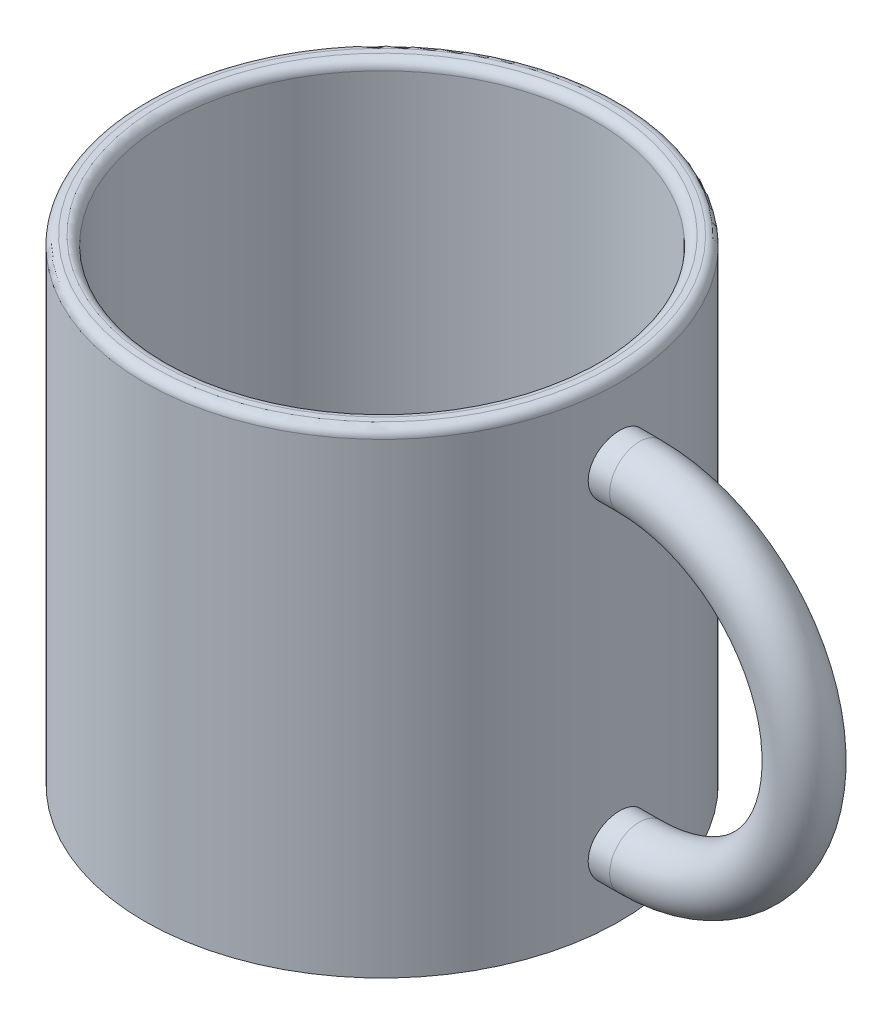
ISO-10303-21;
HEADER;
FILE_DESCRIPTION(('STEP AP214'),'2;1');
FILE_NAME('part.step','',(''),(''),'','','');
FILE_SCHEMA(('AUTOMOTIVE_DESIGN { 1 0 10303 214 1 1 1 1 }'));
ENDSEC;
DATA;
#1=APPLICATION_CONTEXT('core data for automotive mechanical design processes');
#2=APPLICATION_PROTOCOL_DEFINITION('international standard','automotive_design',2000,#1);
#3=PRODUCT_CONTEXT('',#1,'mechanical');
#4=PRODUCT('Part','Part','',(#3));
#5=PRODUCT_RELATED_PRODUCT_CATEGORY('part','',(#4));
#6=PRODUCT_DEFINITION_FORMATION('','',#4);
#7=PRODUCT_DEFINITION_CONTEXT('part definition',#1,'design');
#8=PRODUCT_DEFINITION('design','',#6,#7);
#9=PRODUCT_DEFINITION_SHAPE('','',#8);
#10=(LENGTH_UNIT() NAMED_UNIT(*) SI_UNIT(.MILLI.,.METRE.));
#11=(NAMED_UNIT(*) PLANE_ANGLE_UNIT() SI_UNIT($,.RADIAN.));
#12=(NAMED_UNIT(*) SI_UNIT($,.STERADIAN.) SOLID_ANGLE_UNIT());
#13=UNCERTAINTY_MEASURE_WITH_UNIT(LENGTH_MEASURE(1.E-05),#10,'distance_accuracy_value','');
#14=(GEOMETRIC_REPRESENTATION_CONTEXT(3) GLOBAL_UNCERTAINTY_ASSIGNED_CONTEXT((#13)) GLOBAL_UNIT_ASSIGNED_CONTEXT((#10,
#11,#12)) REPRESENTATION_CONTEXT('',''));
#15=CARTESIAN_POINT('',(0.,0.,0.));
#16=DIRECTION('',(0.,0.,1.));
#17=DIRECTION('',(1.,0.,0.));
#18=AXIS2_PLACEMENT_3D('',#15,#16,#17);
#19=CARTESIAN_POINT('',(-4.40205199535898,86.4092479750852,5.0483032446709E-06));
#20=DIRECTION('',(0.,-1.,0.));
#21=DIRECTION('',(0.,0.,-1.));
#22=AXIS2_PLACEMENT_3D('',#19,#20,#21);
#23=CYLINDRICAL_SURFACE('',#22,60.);
#24=CARTESIAN_POINT('',(-4.40205199535898,84.1592479750852,5.0483032446709E-06));
#25=DIRECTION('',(0.,1.,0.));
#26=DIRECTION('',(0.,0.,1.));
#27=AXIS2_PLACEMENT_3D('',#24,#25,#26);
#28=CIRCLE('',#27,60.);
#29=CARTESIAN_POINT('',(-4.40205199535898,84.1592479750852,60.0000050483032));
#30=VERTEX_POINT('',#29);
#31=EDGE_CURVE('E54',#30,#30,#28,.F.);
#32=ORIENTED_EDGE('',*,*,#31,.T.);
#33=EDGE_LOOP('',(#32));
#34=FACE_BOUND('',#33,.T.);
#35=CARTESIAN_POINT('',(55.1273525035943,-16.9317475000279,7.50000504830325));
#36=CARTESIAN_POINT('',(55.1273516728842,-16.7219195231285,7.50000745762795));
#37=CARTESIAN_POINT('',(55.128464141222,-16.5121268971961,7.49119634433972));
#38=CARTESIAN_POINT('',(55.1328804109412,-16.0939752839577,7.45601962138458));
#39=CARTESIAN_POINT('',(55.1361847091381,-15.8856166325072,7.42965003178556));
#40=CARTESIAN_POINT('',(55.1448940245418,-15.4717370014469,7.35952013181566));
#41=CARTESIAN_POINT('',(55.1503006072433,-15.2662182549915,7.3157468610097));
#42=CARTESIAN_POINT('',(55.1630607297109,-14.8595573749985,7.21111609212237));
#43=CARTESIAN_POINT('',(55.1704149827241,-14.6584168740589,7.15025233492224));
#44=CARTESIAN_POINT('',(55.1868498443608,-14.2622228212685,7.01196738741146));
#45=CARTESIAN_POINT('',(55.1959286263393,-14.0671630808122,6.93456370567615));
#46=CARTESIAN_POINT('',(55.2155624673227,-13.6842037034179,6.76369039077564));
#47=CARTESIAN_POINT('',(55.2261180698112,-13.4963067349859,6.67021484010202));
#48=CARTESIAN_POINT('',(55.2483975379972,-13.129157226942,6.4679422607008));
#49=CARTESIAN_POINT('',(55.2601207612263,-12.9499000131158,6.35915364432168));
#50=CARTESIAN_POINT('',(55.2844143934686,-12.6010944084622,6.12694207345108));
#51=CARTESIAN_POINT('',(55.2969851153869,-12.4315496467772,6.00351370090322));
#52=CARTESIAN_POINT('',(55.3226763998821,-12.1026491172853,5.74231406331745));
#53=CARTESIAN_POINT('',(55.3357992395275,-11.9433441802939,5.60447901274513));
#54=CARTESIAN_POINT('',(55.36217432025,-11.6368372054655,5.31585439025784));
#55=CARTESIAN_POINT('',(55.3754266073903,-11.4896396656036,5.1650600460445));
#56=CARTESIAN_POINT('',(55.4016781603871,-11.2084852999894,4.85166168652769));
#57=CARTESIAN_POINT('',(55.414677505339,-11.0745242799379,4.6890614407144));
#58=CARTESIAN_POINT('',(55.440066472473,-10.8206835761457,4.3530779872731));
#59=CARTESIAN_POINT('',(55.4524558679777,-10.7008091048197,4.1796908242546));
#60=CARTESIAN_POINT('',(55.4763081842913,-10.4756968924043,3.8228382803089));
#61=CARTESIAN_POINT('',(55.4877680864048,-10.3705060996266,3.6393430760415));
#62=CARTESIAN_POINT('',(55.5093930467323,-10.1759650109121,3.26406290418867));
#63=CARTESIAN_POINT('',(55.5195580901868,-10.086614895529,3.07227784214552));
#64=CARTESIAN_POINT('',(55.5383037186305,-9.92441298521699,2.68178775546673));
#65=CARTESIAN_POINT('',(55.5468843746456,-9.85156045068942,2.48308304150512));
#66=CARTESIAN_POINT('',(55.5622173433109,-9.72288617899359,2.08016019281935));
#67=CARTESIAN_POINT('',(55.5689696235095,-9.66706474410576,1.87594196030726));
#68=CARTESIAN_POINT('',(55.5804214125878,-9.57312798956593,1.46458189403989));
#69=CARTESIAN_POINT('',(55.5851318531583,-9.53491830780717,1.25746191585353));
#70=CARTESIAN_POINT('',(55.5924211857867,-9.47603402838851,0.840636936892192));
#71=CARTESIAN_POINT('',(55.594999340431,-9.45536549696341,0.630931067256711));
#72=CARTESIAN_POINT('',(55.5979461398982,-9.43175204586593,0.210576673230824));
#73=CARTESIAN_POINT('',(55.5983156566915,-9.42880013166991,-7.14462842573045E-05));
#74=CARTESIAN_POINT('',(55.5968419664935,-9.44060310419811,-0.420884280927014));
#75=CARTESIAN_POINT('',(55.5949979441519,-9.45536451557111,-0.63104878934133));
#76=CARTESIAN_POINT('',(55.5862331722374,-9.52587045831438,-1.25604095759549));
#77=CARTESIAN_POINT('',(55.5760985352602,-9.60768148533513,-1.66820162834498));
#78=CARTESIAN_POINT('',(55.5483308259854,-9.83870174006814,-2.47266838533065));
#79=CARTESIAN_POINT('',(55.5306976111372,-9.9879122490705,-2.86497409395868));
#80=CARTESIAN_POINT('',(55.4898354313784,-10.3499167873245,-3.62010338999481));
#81=CARTESIAN_POINT('',(55.4665915375175,-10.5628808219484,-3.98284480888444));
#82=CARTESIAN_POINT('',(55.417107159024,-11.0462226379485,-4.66757213517146));
#83=CARTESIAN_POINT('',(55.3908665369861,-11.3166030524558,-4.98955617234271));
#84=CARTESIAN_POINT('',(55.3381140080176,-11.909302941705,-5.58595773815715));
#85=CARTESIAN_POINT('',(55.3116014727174,-12.2319647739785,-5.86003512315752));
#86=CARTESIAN_POINT('',(55.2614701689239,-12.9188921750647,-6.3501938521004));
#87=CARTESIAN_POINT('',(55.2378514095015,-13.2831578742818,-6.56627501425089));
#88=CARTESIAN_POINT('',(55.1961820810887,-14.0432559820732,-6.93432858415866));
#89=CARTESIAN_POINT('',(55.1781338802185,-14.4391017260104,-7.08627373688785));
#90=CARTESIAN_POINT('',(55.149695281186,-15.2509658744849,-7.3214399194967));
#91=CARTESIAN_POINT('',(55.1393045139736,-15.6669833058174,-7.4046642614001));
#92=CARTESIAN_POINT('',(55.127424663463,-16.504376995507,-7.49957631764126));
#93=CARTESIAN_POINT('',(55.1258760108214,-16.9256981815849,-7.51174276195565));
#94=CARTESIAN_POINT('',(55.131698255321,-17.7643734767296,-7.46545552713046));
#95=CARTESIAN_POINT('',(55.1390689623467,-18.1817276701615,-7.40700335322208));
#96=CARTESIAN_POINT('',(55.161844795713,-18.9991840928271,-7.22154587229716));
#97=CARTESIAN_POINT('',(55.177222749094,-19.3993397450095,-7.09477236624995));
#98=CARTESIAN_POINT('',(55.2142593401604,-20.1727225652684,-6.77649214559088));
#99=CARTESIAN_POINT('',(55.2359181985092,-20.5459487866737,-6.58498315662677));
#100=CARTESIAN_POINT('',(55.2832150584343,-21.2570016752939,-6.14155588708251));
#101=CARTESIAN_POINT('',(55.3088734690709,-21.5946309964594,-5.88932393772638));
#102=CARTESIAN_POINT('',(55.3612285089834,-22.2230536627647,-5.33181154934117));
#103=CARTESIAN_POINT('',(55.3879251786117,-22.5138451852668,-5.02652904687287));
#104=CARTESIAN_POINT('',(55.426567247063,-22.9092962160535,-4.53472057159022));
#105=CARTESIAN_POINT('',(55.4392543205326,-23.0346754666651,-4.36450785400844));
#106=CARTESIAN_POINT('',(55.4637799861621,-23.2706425254571,-4.01408817988717));
#107=CARTESIAN_POINT('',(55.4756188900036,-23.3812357802067,-3.83388493825285));
#108=CARTESIAN_POINT('',(55.4981166979563,-23.5868711594592,-3.46467646467589));
#109=CARTESIAN_POINT('',(55.5087751896826,-23.6819078546839,-3.27566818919246));
#110=CARTESIAN_POINT('',(55.5286024212752,-23.8556762369068,-2.89029994381967));
#111=CARTESIAN_POINT('',(55.5377716884877,-23.9344136983175,-2.69394260673105));
#112=CARTESIAN_POINT('',(55.554342895809,-24.0748661366292,-2.29571378590779));
#113=CARTESIAN_POINT('',(55.5617492066624,-24.1366232716666,-2.09385735151424));
#114=CARTESIAN_POINT('',(55.5746136993204,-24.2429180013362,-1.68560349392138));
#115=CARTESIAN_POINT('',(55.5800719262674,-24.2874559949858,-1.47920617606461));
#116=CARTESIAN_POINT('',(55.5888850070858,-24.3589801021919,-1.06335182259545));
#117=CARTESIAN_POINT('',(55.5922399011966,-24.385966551532,-0.853894845596655));
#118=CARTESIAN_POINT('',(55.5967507630997,-24.4221851821885,-0.433431499046688));
#119=CARTESIAN_POINT('',(55.597906775446,-24.4314177232355,-0.222425160975727));
#120=CARTESIAN_POINT('',(55.5979867970588,-24.4320577829696,0.198211888497949));
#121=CARTESIAN_POINT('',(55.5969255817518,-24.423583299816,0.407842427082098));
#122=CARTESIAN_POINT('',(55.5926316679839,-24.3891169596966,0.825562219588639));
#123=CARTESIAN_POINT('',(55.5893997292367,-24.3631312313365,1.03365198700132));
#124=CARTESIAN_POINT('',(55.5808552319251,-24.293835501424,1.44692137129249));
#125=CARTESIAN_POINT('',(55.575542297486,-24.2505223701207,1.65210045549434));
#126=CARTESIAN_POINT('',(55.562985150777,-24.1468928343142,2.05805296620777));
#127=CARTESIAN_POINT('',(55.5557409794309,-24.0865767901081,2.25882648597748));
#128=CARTESIAN_POINT('',(55.5395270057377,-23.9494056491818,2.65449204687226));
#129=CARTESIAN_POINT('',(55.5305577939761,-23.8725562117763,2.84938607456066));
#130=CARTESIAN_POINT('',(55.5111426629522,-23.7028622019309,3.23200185097219));
#131=CARTESIAN_POINT('',(55.5006967582042,-23.6100177867043,3.41972367016819));
#132=CARTESIAN_POINT('',(55.4786169753045,-23.4089765052994,3.78673065235454));
#133=CARTESIAN_POINT('',(55.4669828715924,-23.3007767226293,3.96601420400498));
#134=CARTESIAN_POINT('',(55.4428562089809,-23.0698428742534,4.31480710435326));
#135=CARTESIAN_POINT('',(55.4303639596409,-22.9471140381844,4.48431993748717));
#136=CARTESIAN_POINT('',(55.4047757056614,-22.6870488824675,4.8136135180227));
#137=CARTESIAN_POINT('',(55.3916761220878,-22.5496173813515,4.9733188256801));
#138=CARTESIAN_POINT('',(55.3653278141784,-22.2618696141698,5.28054280450672));
#139=CARTESIAN_POINT('',(55.3520791456317,-22.1115580372396,5.42806587266968));
#140=CARTESIAN_POINT('',(55.3257931517462,-21.7989592927908,5.71004739802776));
#141=CARTESIAN_POINT('',(55.3127559590657,-21.6366649378372,5.84449790025711));
#142=CARTESIAN_POINT('',(55.2872745169921,-21.3013729027553,6.09924160725989));
#143=CARTESIAN_POINT('',(55.2748300504189,-21.1283791972045,6.21954002160365));
#144=CARTESIAN_POINT('',(55.2508310649251,-20.7720829403043,6.44566490249995));
#145=CARTESIAN_POINT('',(55.2392805470925,-20.5887397540392,6.55142778324764));
#146=CARTESIAN_POINT('',(55.2174644170038,-20.2137820816202,6.74707495648724));
#147=CARTESIAN_POINT('',(55.2071983337479,-20.0221706622812,6.83696507449473));
#148=CARTESIAN_POINT('',(55.1882500935756,-19.6321184723321,7.00019441528185));
#149=CARTESIAN_POINT('',(55.1795667007223,-19.4336831757496,7.07354656340961));
#150=CARTESIAN_POINT('',(55.1640273250525,-19.0313270764244,7.20322988204138));
#151=CARTESIAN_POINT('',(55.1571709109582,-18.827407580821,7.259565070001));
#152=CARTESIAN_POINT('',(55.1434793120096,-18.3447727190325,7.37116046492179));
#153=CARTESIAN_POINT('',(55.1374576743434,-18.0643879946232,7.41942740908913));
#154=CARTESIAN_POINT('',(55.129394847498,-17.4998964013695,7.48384794821455));
#155=CARTESIAN_POINT('',(55.1273536281184,-17.2157895607823,7.50000178682419));
#156=CARTESIAN_POINT('',(55.1273525035943,-16.9317475000279,7.50000504830325));
#157=B_SPLINE_CURVE_WITH_KNOTS('',3,(#35,#36,#37,#38,#39,#40,#41,#42,#43,#44,#45,#46,#47,#48,
#49,#50,#51,#52,#53,#54,#55,#56,#57,#58,#59,#60,#61,#62,#63,#64,#65,#66,#67,#68,#69,#70,#71,#72,
#73,#74,#75,#76,#77,#78,#79,#80,#81,#82,#83,#84,#85,#86,#87,#88,#89,#90,#91,#92,#93,#94,#95,#96,
#97,#98,#99,#100,#101,#102,#103,#104,#105,#106,#107,#108,#109,#110,#111,#112,#113,#114,#115,
#116,#117,#118,#119,#120,#121,#122,#123,#124,#125,#126,#127,#128,#129,#130,#131,#132,#133,#134,
#135,#136,#137,#138,#139,#140,#141,#142,#143,#144,#145,#146,#147,#148,#149,#150,#151,#152,#153,
#154,#155,#156),.UNSPECIFIED.,.T.,.F.,(4,2,2,2,2,2,2,2,2,2,2,2,2,2,2,2,2,2,2,2,2,2,2,2,2,2,2,2,
2,2,2,2,2,2,2,2,2,2,2,2,2,2,2,2,2,2,2,2,2,2,2,2,2,2,2,2,2,2,2,2,4),(0.,0.629235324624849,
1.25861332488502,1.8884609003476,2.51853944899679,3.14795429413481,3.77760138201524,
4.40690390878109,5.03644006637225,5.66889211451574,6.30157807125906,6.93406289945341,
7.56678103253858,8.2014779675225,8.83618213638638,9.47085784536276,10.1055448183727,
10.7367904965995,11.3682543889034,11.9994689627422,12.6309161139088,13.8854025867967,
15.1399129089592,16.3977987711896,17.6557423328786,18.9222835601386,20.1888287573883,
21.4559116409758,22.7229334534912,23.981409172982,25.239858068619,26.4940639275875,
27.7483138551611,29.0091872251288,30.2701096486498,30.9048473756283,31.539350642615,
32.1740748828506,32.8085738697948,33.4414830211465,34.0743775052848,34.707259880983,
35.3401294330456,35.9687950485062,36.5972407570427,37.2258000294613,37.8543459835114,
38.482677130125,39.1110021012775,39.7394465722238,40.3676655225966,41.000230518052,
41.6325661917027,42.2652842794141,42.89776872157,43.5329374317485,44.1678725398156,
44.8023096769907,45.4365969155535,46.2883930250815,47.1401826717573),.UNSPECIFIED.);
#158=CARTESIAN_POINT('',(55.1273525035943,-16.9317475000279,7.50000504830325));
#159=VERTEX_POINT('',#158);
#160=EDGE_CURVE('E66',#159,#159,#157,.T.);
#161=ORIENTED_EDGE('',*,*,#160,.T.);
#162=EDGE_LOOP('',(#161));
#163=FACE_BOUND('',#162,.T.);
#164=CARTESIAN_POINT('',(-4.40205199535898,-33.5907520249148,5.0483032446709E-06));
#165=DIRECTION('',(0.,1.,0.));
#166=DIRECTION('',(0.,0.,1.));
#167=AXIS2_PLACEMENT_3D('',#164,#165,#166);
#168=CIRCLE('',#167,60.);
#169=CARTESIAN_POINT('',(-4.40205199535898,-33.5907520249148,60.0000050483032));
#170=VERTEX_POINT('',#169);
#171=EDGE_CURVE('E74',#170,#170,#168,.T.);
#172=ORIENTED_EDGE('',*,*,#171,.T.);
#173=EDGE_LOOP('',(#172));
#174=FACE_BOUND('',#173,.T.);
#175=CARTESIAN_POINT('',(55.1273525035943,66.2282524999721,7.50000504830325));
#176=CARTESIAN_POINT('',(55.1273516728842,66.0184245230726,7.50000745762795));
#177=CARTESIAN_POINT('',(55.128464141222,65.8086318971403,7.49119634433972));
#178=CARTESIAN_POINT('',(55.1328804109412,65.3904802839018,7.45601962138458));
#179=CARTESIAN_POINT('',(55.1361847091381,65.1821216324514,7.42965003178557));
#180=CARTESIAN_POINT('',(55.1448940245418,64.7682420013911,7.35952013181566));
#181=CARTESIAN_POINT('',(55.1503006072433,64.5627232549356,7.3157468610097));
#182=CARTESIAN_POINT('',(55.1630607297109,64.1560623749426,7.21111609212237));
#183=CARTESIAN_POINT('',(55.1704149827241,63.954921874003,7.15025233492224));
#184=CARTESIAN_POINT('',(55.1868498443608,63.5587278212127,7.01196738741146));
#185=CARTESIAN_POINT('',(55.1959286263393,63.3636680807564,6.93456370567615));
#186=CARTESIAN_POINT('',(55.2155624673227,62.980708703362,6.76369039077564));
#187=CARTESIAN_POINT('',(55.2261180698112,62.7928117349301,6.67021484010202));
#188=CARTESIAN_POINT('',(55.2483975379972,62.4256622268862,6.4679422607008));
#189=CARTESIAN_POINT('',(55.2601207612263,62.24640501306,6.35915364432168));
#190=CARTESIAN_POINT('',(55.2844143934686,61.8975994084064,6.12694207345108));
#191=CARTESIAN_POINT('',(55.2969851153869,61.7280546467213,6.00351370090322));
#192=CARTESIAN_POINT('',(55.3226763998821,61.3991541172294,5.74231406331745));
#193=CARTESIAN_POINT('',(55.3357992395275,61.239849180238,5.60447901274512));
#194=CARTESIAN_POINT('',(55.36217432025,60.9333422054096,5.31585439025784));
#195=CARTESIAN_POINT('',(55.3754266073903,60.7861446655478,5.1650600460445));
#196=CARTESIAN_POINT('',(55.4016781603871,60.5049902999335,4.85166168652769));
#197=CARTESIAN_POINT('',(55.414677505339,60.3710292798821,4.6890614407144));
#198=CARTESIAN_POINT('',(55.440066472473,60.1171885760899,4.3530779872731));
#199=CARTESIAN_POINT('',(55.4524558679777,59.9973141047638,4.17969082425461));
#200=CARTESIAN_POINT('',(55.4763081842913,59.7722018923485,3.82283828030891));
#201=CARTESIAN_POINT('',(55.4877680864048,59.6670110995708,3.63934307604151));
#202=CARTESIAN_POINT('',(55.5093930467323,59.4724700108562,3.26406290418868));
#203=CARTESIAN_POINT('',(55.5195580901868,59.3831198954732,3.07227784214553));
#204=CARTESIAN_POINT('',(55.5383037186305,59.2209179851612,2.68178775546675));
#205=CARTESIAN_POINT('',(55.5468843746456,59.1480654506336,2.48308304150513));
#206=CARTESIAN_POINT('',(55.5622173433109,59.0193911789378,2.08016019281936));
#207=CARTESIAN_POINT('',(55.5689696235095,58.9635697440499,1.87594196030727));
#208=CARTESIAN_POINT('',(55.5804214125878,58.8696329895101,1.4645818940399));
#209=CARTESIAN_POINT('',(55.5851318531583,58.8314233077513,1.25746191585355));
#210=CARTESIAN_POINT('',(55.5924211857867,58.7725390283327,0.840636936892203));
#211=CARTESIAN_POINT('',(55.594999340431,58.7518704969076,0.630931067256722));
#212=CARTESIAN_POINT('',(55.5979461398982,58.7282570458101,0.210576673230835));
#213=CARTESIAN_POINT('',(55.5983156566915,58.7253051316141,-7.14462842466251E-05));
#214=CARTESIAN_POINT('',(55.5968419664935,58.7371081041423,-0.420884280927003));
#215=CARTESIAN_POINT('',(55.5949979441519,58.7518695155153,-0.631048789341319));
#216=CARTESIAN_POINT('',(55.5862331722374,58.8223754582585,-1.25604095759547));
#217=CARTESIAN_POINT('',(55.5760985352602,58.9041864852793,-1.66820162834497));
#218=CARTESIAN_POINT('',(55.5483308259854,59.1352067400123,-2.47266838533063));
#219=CARTESIAN_POINT('',(55.5306976111372,59.2844172490146,-2.86497409395867));
#220=CARTESIAN_POINT('',(55.4898354313784,59.6464217872686,-3.6201033899948));
#221=CARTESIAN_POINT('',(55.4665915375175,59.8593858218925,-3.98284480888442));
#222=CARTESIAN_POINT('',(55.417107159024,60.3427276378926,-4.66757213517144));
#223=CARTESIAN_POINT('',(55.3908665369861,60.6131080524,-4.9895561723427));
#224=CARTESIAN_POINT('',(55.3381140080176,61.2058079416492,-5.58595773815714));
#225=CARTESIAN_POINT('',(55.3116014727174,61.5284697739226,-5.86003512315751));
#226=CARTESIAN_POINT('',(55.2614701689239,62.2153971750089,-6.3501938521004));
#227=CARTESIAN_POINT('',(55.2378514095015,62.5796628742259,-6.56627501425089));
#228=CARTESIAN_POINT('',(55.1961820810887,63.3397609820174,-6.93432858415865));
#229=CARTESIAN_POINT('',(55.1781338802185,63.7356067259545,-7.08627373688785));
#230=CARTESIAN_POINT('',(55.149695281186,64.547470874429,-7.32143991949669));
#231=CARTESIAN_POINT('',(55.1393045139736,64.9634883057615,-7.40466426140009));
#232=CARTESIAN_POINT('',(55.127424663463,65.8008819954511,-7.49957631764126));
#233=CARTESIAN_POINT('',(55.1258760108214,66.222203181529,-7.51174276195565));
#234=CARTESIAN_POINT('',(55.131698255321,67.0608784766737,-7.46545552713046));
#235=CARTESIAN_POINT('',(55.1390689623467,67.4782326701056,-7.40700335322208));
#236=CARTESIAN_POINT('',(55.161844795713,68.2956890927712,-7.22154587229717));
#237=CARTESIAN_POINT('',(55.177222749094,68.6958447449537,-7.09477236624996));
#238=CARTESIAN_POINT('',(55.2142593401604,69.4692275652125,-6.77649214559089));
#239=CARTESIAN_POINT('',(55.2359181985092,69.8424537866179,-6.58498315662679));
#240=CARTESIAN_POINT('',(55.2832150584343,70.5535066752381,-6.14155588708252));
#241=CARTESIAN_POINT('',(55.3088734690709,70.8911359964036,-5.88932393772639));
#242=CARTESIAN_POINT('',(55.3612285089834,71.5195586627089,-5.33181154934117));
#243=CARTESIAN_POINT('',(55.3879251786117,71.810350185211,-5.02652904687287));
#244=CARTESIAN_POINT('',(55.426567247063,72.2058012159976,-4.53472057159022));
#245=CARTESIAN_POINT('',(55.4392543205326,72.3311804666092,-4.36450785400844));
#246=CARTESIAN_POINT('',(55.4637799861621,72.5671475254012,-4.01408817988717));
#247=CARTESIAN_POINT('',(55.4756188900036,72.6777407801509,-3.83388493825285));
#248=CARTESIAN_POINT('',(55.4981166979563,72.8833761594033,-3.46467646467589));
#249=CARTESIAN_POINT('',(55.5087751896826,72.9784128546281,-3.27566818919246));
#250=CARTESIAN_POINT('',(55.5286024212752,73.1521812368509,-2.89029994381968));
#251=CARTESIAN_POINT('',(55.5377716884877,73.2309186982616,-2.69394260673106));
#252=CARTESIAN_POINT('',(55.554342895809,73.3713711365733,-2.29571378590779));
#253=CARTESIAN_POINT('',(55.5617492066624,73.4331282716107,-2.09385735151424));
#254=CARTESIAN_POINT('',(55.5746136993204,73.5394230012804,-1.68560349392138));
#255=CARTESIAN_POINT('',(55.5800719262674,73.58396099493,-1.47920617606462));
#256=CARTESIAN_POINT('',(55.5888850070858,73.6554851021361,-1.06335182259546));
#257=CARTESIAN_POINT('',(55.5922399011966,73.6824715514762,-0.853894845596667));
#258=CARTESIAN_POINT('',(55.5967507630997,73.7186901821326,-0.433431499046704));
#259=CARTESIAN_POINT('',(55.597906775446,73.7279227231797,-0.222425160975746));
#260=CARTESIAN_POINT('',(55.5979867970588,73.7285627829137,0.198211888497928));
#261=CARTESIAN_POINT('',(55.5969255817518,73.7200882997601,0.407842427082077));
#262=CARTESIAN_POINT('',(55.5926316679839,73.6856219596408,0.825562219588618));
#263=CARTESIAN_POINT('',(55.5893997292367,73.6596362312807,1.0336519870013));
#264=CARTESIAN_POINT('',(55.5808552319251,73.5903405013681,1.44692137129247));
#265=CARTESIAN_POINT('',(55.575542297486,73.5470273700649,1.65210045549432));
#266=CARTESIAN_POINT('',(55.562985150777,73.4433978342584,2.05805296620775));
#267=CARTESIAN_POINT('',(55.5557409794309,73.3830817900522,2.25882648597747));
#268=CARTESIAN_POINT('',(55.5395270057377,73.2459106491259,2.65449204687225));
#269=CARTESIAN_POINT('',(55.5305577939761,73.1690612117205,2.84938607456065));
#270=CARTESIAN_POINT('',(55.5111426629522,72.9993672018751,3.23200185097218));
#271=CARTESIAN_POINT('',(55.5006967582042,72.9065227866485,3.41972367016818));
#272=CARTESIAN_POINT('',(55.4786169753045,72.7054815052436,3.78673065235453));
#273=CARTESIAN_POINT('',(55.4669828715924,72.5972817225735,3.96601420400497));
#274=CARTESIAN_POINT('',(55.4428562089809,72.3663478741975,4.31480710435325));
#275=CARTESIAN_POINT('',(55.4303639596409,72.2436190381286,4.48431993748716));
#276=CARTESIAN_POINT('',(55.4047757056614,71.9835538824116,4.81361351802269));
#277=CARTESIAN_POINT('',(55.3916761220878,71.8461223812956,4.97331882568009));
#278=CARTESIAN_POINT('',(55.3653278141784,71.558374614114,5.28054280450672));
#279=CARTESIAN_POINT('',(55.3520791456317,71.4080630371838,5.42806587266967));
#280=CARTESIAN_POINT('',(55.3257931517462,71.095464292735,5.71004739802775));
#281=CARTESIAN_POINT('',(55.3127559590657,70.9331699377813,5.8444979002571));
#282=CARTESIAN_POINT('',(55.2872745169921,70.5978779026995,6.09924160725987));
#283=CARTESIAN_POINT('',(55.2748300504189,70.4248841971487,6.21954002160363));
#284=CARTESIAN_POINT('',(55.2508310649251,70.0685879402485,6.44566490249994));
#285=CARTESIAN_POINT('',(55.2392805470925,69.8852447539833,6.55142778324763));
#286=CARTESIAN_POINT('',(55.2174644170038,69.5102870815643,6.74707495648723));
#287=CARTESIAN_POINT('',(55.2071983337479,69.3186756622254,6.83696507449472));
#288=CARTESIAN_POINT('',(55.1882500935756,68.9286234722763,7.00019441528184));
#289=CARTESIAN_POINT('',(55.1795667007223,68.7301881756937,7.07354656340962));
#290=CARTESIAN_POINT('',(55.1640273250525,68.3278320763686,7.20322988204138));
#291=CARTESIAN_POINT('',(55.1571709109582,68.1239125807652,7.259565070001));
#292=CARTESIAN_POINT('',(55.1434793120096,67.6412777189766,7.37116046492178));
#293=CARTESIAN_POINT('',(55.1374576743434,67.3608929945674,7.41942740908913));
#294=CARTESIAN_POINT('',(55.129394847498,66.7964014013136,7.48384794821455));
#295=CARTESIAN_POINT('',(55.1273536281184,66.5122945607264,7.50000178682419));
#296=CARTESIAN_POINT('',(55.1273525035943,66.2282524999721,7.50000504830325));
#297=B_SPLINE_CURVE_WITH_KNOTS('',3,(#175,#176,#177,#178,#179,#180,#181,#182,#183,#184,#185,
#186,#187,#188,#189,#190,#191,#192,#193,#194,#195,#196,#197,#198,#199,#200,#201,#202,#203,#204,
#205,#206,#207,#208,#209,#210,#211,#212,#213,#214,#215,#216,#217,#218,#219,#220,#221,#222,#223,
#224,#225,#226,#227,#228,#229,#230,#231,#232,#233,#234,#235,#236,#237,#238,#239,#240,#241,#242,
#243,#244,#245,#246,#247,#248,#249,#250,#251,#252,#253,#254,#255,#256,#257,#258,#259,#260,#261,
#262,#263,#264,#265,#266,#267,#268,#269,#270,#271,#272,#273,#274,#275,#276,#277,#278,#279,#280,
#281,#282,#283,#284,#285,#286,#287,#288,#289,#290,#291,#292,#293,#294,#295,#296),.UNSPECIFIED.,
.T.,.F.,(4,2,2,2,2,2,2,2,2,2,2,2,2,2,2,2,2,2,2,2,2,2,2,2,2,2,2,2,2,2,2,2,2,2,2,2,2,2,2,2,2,2,2,
2,2,2,2,2,2,2,2,2,2,2,2,2,2,2,2,2,4),(0.,0.629235324624828,1.258613324885,1.8884609003476,
2.51853944899678,3.1479542941348,3.77760138201524,4.40690390878109,5.03644006637225,
5.66889211451574,6.30157807125905,6.9340628994534,7.56678103253857,8.20147796752249,
8.83618213638636,9.47085784536275,10.1055448183727,10.7367904965995,11.3682543889034,
11.9994689627422,12.6309161139087,13.8854025867966,15.1399129089592,16.3977987711896,
17.6557423328786,18.9222835601386,20.1888287573883,21.4559116409757,22.7229334534911,
23.981409172982,25.2398580686189,26.4940639275875,27.7483138551611,29.0091872251288,
30.2701096486498,30.9048473756283,31.539350642615,32.1740748828505,32.8085738697948,
33.4414830211465,34.0743775052848,34.7072598809829,35.3401294330456,35.9687950485062,
36.5972407570426,37.2258000294613,37.8543459835114,38.482677130125,39.1110021012775,
39.7394465722238,40.3676655225966,41.000230518052,41.6325661917027,42.2652842794141,
42.8977687215699,43.5329374317484,44.1678725398156,44.8023096769907,45.4365969155535,
46.2883930250815,47.1401826717573),.UNSPECIFIED.);
#298=CARTESIAN_POINT('',(55.1273525035943,66.2282524999721,7.50000504830325));
#299=VERTEX_POINT('',#298);
#300=EDGE_CURVE('E65',#299,#299,#297,.T.);
#301=ORIENTED_EDGE('',*,*,#300,.F.);
#302=EDGE_LOOP('',(#301));
#303=FACE_BOUND('',#302,.T.);
#304=ADVANCED_FACE('F39',(#34,#163,#174,#303),#23,.T.);
#305=CARTESIAN_POINT('',(-4.40205199535898,86.4092479750852,5.0483032446709E-06));
#306=DIRECTION('',(0.,1.,0.));
#307=DIRECTION('',(0.,0.,1.));
#308=AXIS2_PLACEMENT_3D('',#305,#306,#307);
#309=PLANE('',#308);
#310=CARTESIAN_POINT('',(-4.40205199535898,86.4092479750852,5.0483032446709E-06));
#311=DIRECTION('',(0.,1.,0.));
#312=DIRECTION('',(0.,0.,1.));
#313=AXIS2_PLACEMENT_3D('',#310,#311,#312);
#314=CIRCLE('',#313,57.75);
#315=CARTESIAN_POINT('',(-4.40205199535898,86.4092479750852,57.7500050483032));
#316=VERTEX_POINT('',#315);
#317=EDGE_CURVE('E59',#316,#316,#314,.T.);
#318=ORIENTED_EDGE('',*,*,#317,.T.);
#319=EDGE_LOOP('',(#318));
#320=FACE_BOUND('',#319,.T.);
#321=CARTESIAN_POINT('',(-4.40205199535898,86.4092479750852,5.0483032446709E-06));
#322=DIRECTION('',(0.,1.,0.));
#323=DIRECTION('',(0.,0.,1.));
#324=AXIS2_PLACEMENT_3D('',#321,#322,#323);
#325=CIRCLE('',#324,56.25);
#326=CARTESIAN_POINT('',(-4.40205199535898,86.4092479750852,56.2500050483033));
#327=VERTEX_POINT('',#326);
#328=EDGE_CURVE('E62',#327,#327,#325,.F.);
#329=ORIENTED_EDGE('',*,*,#328,.T.);
#330=EDGE_LOOP('',(#329));
#331=FACE_BOUND('',#330,.T.);
#332=ADVANCED_FACE('F93',(#320,#331),#309,.T.);
#333=CARTESIAN_POINT('',(-4.40205199535898,-33.5907520249148,5.0483032446709E-06));
#334=DIRECTION('',(0.,1.,0.));
#335=DIRECTION('',(0.,0.,1.));
#336=AXIS2_PLACEMENT_3D('',#333,#334,#335);
#337=PLANE('',#336);
#338=ORIENTED_EDGE('',*,*,#171,.F.);
#339=EDGE_LOOP('',(#338));
#340=FACE_BOUND('',#339,.T.);
#341=ADVANCED_FACE('F90',(#340),#337,.F.);
#342=CARTESIAN_POINT('',(60.547948004641,-16.9317475000279,5.0483032446709E-06));
#343=DIRECTION('',(-1.,0.,0.));
#344=DIRECTION('',(0.,0.,1.));
#345=AXIS2_PLACEMENT_3D('',#342,#343,#344);
#346=CYLINDRICAL_SURFACE('',#345,7.5);
#347=CARTESIAN_POINT('',(60.547948004641,-16.9317475000279,5.0483032446709E-06));
#348=DIRECTION('',(-1.,0.,0.));
#349=DIRECTION('',(0.,0.,-1.));
#350=AXIS2_PLACEMENT_3D('',#347,#348,#349);
#351=CIRCLE('',#350,7.5);
#352=CARTESIAN_POINT('',(60.547948004641,-24.4317475000279,5.0483032446709E-06));
#353=VERTEX_POINT('',#352);
#354=EDGE_CURVE('E75',#353,#353,#351,.T.);
#355=ORIENTED_EDGE('',*,*,#354,.T.);
#356=EDGE_LOOP('',(#355));
#357=FACE_BOUND('',#356,.T.);
#358=ORIENTED_EDGE('',*,*,#160,.F.);
#359=EDGE_LOOP('',(#358));
#360=FACE_BOUND('',#359,.T.);
#361=ADVANCED_FACE('F84',(#357,#360),#346,.T.);
#362=CARTESIAN_POINT('',(60.547948004641,66.2282524999721,5.0483032446709E-06));
#363=DIRECTION('',(-1.,0.,0.));
#364=DIRECTION('',(0.,0.,1.));
#365=AXIS2_PLACEMENT_3D('',#362,#363,#364);
#366=CYLINDRICAL_SURFACE('',#365,7.5);
#367=CARTESIAN_POINT('',(60.547948004641,66.2282524999721,5.0483032446709E-06));
#368=DIRECTION('',(1.,0.,0.));
#369=DIRECTION('',(0.,0.,-1.));
#370=AXIS2_PLACEMENT_3D('',#367,#368,#369);
#371=CIRCLE('',#370,7.5);
#372=CARTESIAN_POINT('',(60.547948004641,73.7282524999721,5.0483032446709E-06));
#373=VERTEX_POINT('',#372);
#374=EDGE_CURVE('E117',#373,#373,#371,.T.);
#375=ORIENTED_EDGE('',*,*,#374,.F.);
#376=EDGE_LOOP('',(#375));
#377=FACE_BOUND('',#376,.T.);
#378=ORIENTED_EDGE('',*,*,#300,.T.);
#379=EDGE_LOOP('',(#378));
#380=FACE_BOUND('',#379,.T.);
#381=ADVANCED_FACE('F89',(#377,#380),#366,.T.);
#382=CARTESIAN_POINT('',(60.547948004641,24.6482524999721,5.0483032446709E-06));
#383=DIRECTION('',(0.,0.,-1.));
#384=DIRECTION('',(-1.,0.,0.));
#385=AXIS2_PLACEMENT_3D('',#382,#383,#384);
#386=TOROIDAL_SURFACE('',#385,41.58,7.5);
#387=CARTESIAN_POINT('',(60.547948004641,24.6482524999721,5.0483032446709E-06));
#388=DIRECTION('',(0.,0.,-1.));
#389=DIRECTION('',(-1.,0.,0.));
#390=AXIS2_PLACEMENT_3D('',#387,#388,#389);
#391=CIRCLE('',#390,49.08);
#392=EDGE_CURVE('',#373,#353,#391,.T.);
#393=ORIENTED_EDGE('',*,*,#374,.T.);
#394=ORIENTED_EDGE('',*,*,#354,.F.);
#395=ORIENTED_EDGE('',*,*,#392,.T.);
#396=ORIENTED_EDGE('',*,*,#392,.F.);
#397=EDGE_LOOP('',(#393,#395,#394,#396));
#398=FACE_BOUND('',#397,.T.);
#399=ADVANCED_FACE('F92',(#398),#386,.T.);
#400=CARTESIAN_POINT('',(-4.40205199535898,-186.325816761209,5.0483032446709E-06));
#401=DIRECTION('',(0.,1.,0.));
#402=DIRECTION('',(0.,0.,1.));
#403=AXIS2_PLACEMENT_3D('',#400,#401,#402);
#404=CYLINDRICAL_SURFACE('',#403,54.);
#405=CARTESIAN_POINT('',(-4.40205199535898,-25.3407520249148,5.0483032446709E-06));
#406=DIRECTION('',(0.,1.,0.));
#407=DIRECTION('',(0.,0.,1.));
#408=AXIS2_PLACEMENT_3D('',#405,#406,#407);
#409=CIRCLE('',#408,54.);
#410=CARTESIAN_POINT('',(-4.40205199535898,-25.3407520249148,54.0000050483033));
#411=VERTEX_POINT('',#410);
#412=EDGE_CURVE('E46',#411,#411,#409,.F.);
#413=ORIENTED_EDGE('',*,*,#412,.T.);
#414=EDGE_LOOP('',(#413));
#415=FACE_BOUND('',#414,.T.);
#416=CARTESIAN_POINT('',(-4.40205199535898,84.1592479750852,5.0483032446709E-06));
#417=DIRECTION('',(0.,1.,0.));
#418=DIRECTION('',(0.,0.,1.));
#419=AXIS2_PLACEMENT_3D('',#416,#417,#418);
#420=CIRCLE('',#419,54.);
#421=CARTESIAN_POINT('',(-4.40205199535898,84.1592479750852,54.0000050483033));
#422=VERTEX_POINT('',#421);
#423=EDGE_CURVE('E50',#422,#422,#420,.T.);
#424=ORIENTED_EDGE('',*,*,#423,.T.);
#425=EDGE_LOOP('',(#424));
#426=FACE_BOUND('',#425,.T.);
#427=ADVANCED_FACE('F127',(#415,#426),#404,.F.);
#428=CARTESIAN_POINT('',(-4.40205199535898,-27.5907520249148,5.0483032446709E-06));
#429=DIRECTION('',(0.,1.,0.));
#430=DIRECTION('',(0.,0.,1.));
#431=AXIS2_PLACEMENT_3D('',#428,#429,#430);
#432=PLANE('',#431);
#433=CARTESIAN_POINT('',(-4.40205199535898,-27.5907520249148,5.0483032446709E-06));
#434=DIRECTION('',(0.,1.,0.));
#435=DIRECTION('',(0.,0.,1.));
#436=AXIS2_PLACEMENT_3D('',#433,#434,#435);
#437=CIRCLE('',#436,51.75);
#438=CARTESIAN_POINT('',(-4.40205199535898,-27.5907520249148,51.7500050483033));
#439=VERTEX_POINT('',#438);
#440=EDGE_CURVE('E11',#439,#439,#437,.T.);
#441=ORIENTED_EDGE('',*,*,#440,.T.);
#442=EDGE_LOOP('',(#441));
#443=FACE_BOUND('',#442,.T.);
#444=ADVANCED_FACE('F132',(#443),#432,.T.);
#445=CARTESIAN_POINT('',(-4.40205199535898,84.1592479750852,5.0483032446709E-06));
#446=DIRECTION('',(0.,1.,0.));
#447=DIRECTION('',(0.,0.,1.));
#448=AXIS2_PLACEMENT_3D('',#445,#446,#447);
#449=TOROIDAL_SURFACE('',#448,57.75,2.25);
#450=ORIENTED_EDGE('',*,*,#31,.F.);
#451=EDGE_LOOP('',(#450));
#452=FACE_BOUND('',#451,.T.);
#453=ORIENTED_EDGE('',*,*,#317,.F.);
#454=EDGE_LOOP('',(#453));
#455=FACE_BOUND('',#454,.T.);
#456=ADVANCED_FACE('F134',(#452,#455),#449,.T.);
#457=CARTESIAN_POINT('',(-4.40205199535898,84.1592479750852,5.0483032446709E-06));
#458=DIRECTION('',(0.,1.,0.));
#459=DIRECTION('',(0.,0.,1.));
#460=AXIS2_PLACEMENT_3D('',#457,#458,#459);
#461=TOROIDAL_SURFACE('',#460,56.25,2.25);
#462=ORIENTED_EDGE('',*,*,#328,.F.);
#463=EDGE_LOOP('',(#462));
#464=FACE_BOUND('',#463,.T.);
#465=ORIENTED_EDGE('',*,*,#423,.F.);
#466=EDGE_LOOP('',(#465));
#467=FACE_BOUND('',#466,.T.);
#468=ADVANCED_FACE('F138',(#464,#467),#461,.T.);
#469=CARTESIAN_POINT('',(-4.40205199535898,-25.3407520249148,5.0483032446709E-06));
#470=DIRECTION('',(0.,1.,0.));
#471=DIRECTION('',(0.,0.,1.));
#472=AXIS2_PLACEMENT_3D('',#469,#470,#471);
#473=TOROIDAL_SURFACE('',#472,51.75,2.25);
#474=ORIENTED_EDGE('',*,*,#440,.F.);
#475=EDGE_LOOP('',(#474));
#476=FACE_BOUND('',#475,.T.);
#477=ORIENTED_EDGE('',*,*,#412,.F.);
#478=EDGE_LOOP('',(#477));
#479=FACE_BOUND('',#478,.T.);
#480=ADVANCED_FACE('F41',(#476,#479),#473,.F.);
#481=CLOSED_SHELL('',(#304,#332,#341,#361,#381,#399,#427,#444,#456,#468,#480));
#482=MANIFOLD_SOLID_BREP('B2',#481);
#483=ADVANCED_BREP_SHAPE_REPRESENTATION('',(#18,#482),#14);
#484=SHAPE_DEFINITION_REPRESENTATION(#9,#483);
ENDSEC;
END-ISO-10303-21;
